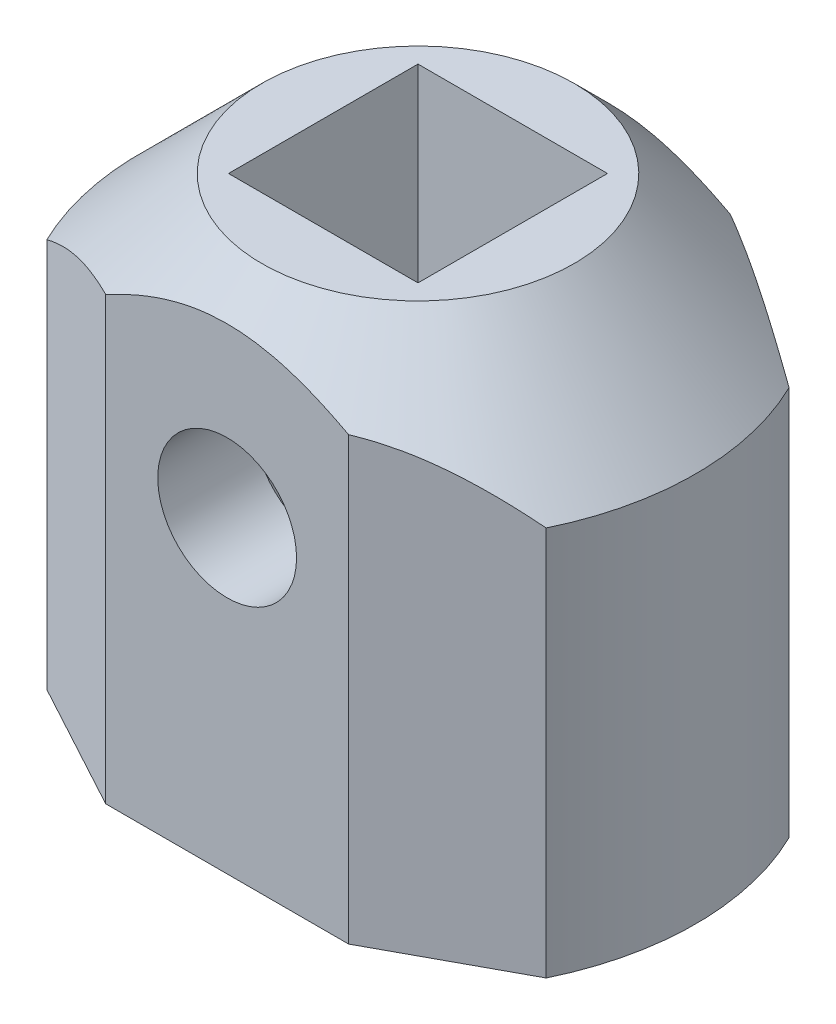
ISO-10303-21;
HEADER;
FILE_DESCRIPTION(('STEP AP214'),'2;1');
FILE_NAME('part.step','',(''),(''),'','','');
FILE_SCHEMA(('AUTOMOTIVE_DESIGN { 1 0 10303 214 1 1 1 1 }'));
ENDSEC;
DATA;
#1=APPLICATION_CONTEXT('core data for automotive mechanical design processes');
#2=APPLICATION_PROTOCOL_DEFINITION('international standard','automotive_design',2000,#1);
#3=PRODUCT_CONTEXT('',#1,'mechanical');
#4=PRODUCT('Part','Part','',(#3));
#5=PRODUCT_RELATED_PRODUCT_CATEGORY('part','',(#4));
#6=PRODUCT_DEFINITION_FORMATION('','',#4);
#7=PRODUCT_DEFINITION_CONTEXT('part definition',#1,'design');
#8=PRODUCT_DEFINITION('design','',#6,#7);
#9=PRODUCT_DEFINITION_SHAPE('','',#8);
#10=(LENGTH_UNIT() NAMED_UNIT(*) SI_UNIT(.MILLI.,.METRE.));
#11=(NAMED_UNIT(*) PLANE_ANGLE_UNIT() SI_UNIT($,.RADIAN.));
#12=(NAMED_UNIT(*) SI_UNIT($,.STERADIAN.) SOLID_ANGLE_UNIT());
#13=UNCERTAINTY_MEASURE_WITH_UNIT(LENGTH_MEASURE(1.E-05),#10,'distance_accuracy_value','');
#14=(GEOMETRIC_REPRESENTATION_CONTEXT(3) GLOBAL_UNCERTAINTY_ASSIGNED_CONTEXT((#13)) GLOBAL_UNIT_ASSIGNED_CONTEXT((#10,
#11,#12)) REPRESENTATION_CONTEXT('',''));
#15=CARTESIAN_POINT('',(0.,0.,0.));
#16=DIRECTION('',(0.,0.,1.));
#17=DIRECTION('',(1.,0.,0.));
#18=AXIS2_PLACEMENT_3D('',#15,#16,#17);
#19=CARTESIAN_POINT('',(0.,22.464,0.));
#20=DIRECTION('',(0.,-1.,0.));
#21=DIRECTION('',(0.,0.,-1.));
#22=AXIS2_PLACEMENT_3D('',#19,#20,#21);
#23=CONICAL_SURFACE('',#22,16.,0.785398163397447);
#24=CARTESIAN_POINT('',(0.,29.464,0.));
#25=DIRECTION('',(0.,-1.,0.));
#26=DIRECTION('',(0.,0.,-1.));
#27=AXIS2_PLACEMENT_3D('',#24,#25,#26);
#28=CIRCLE('',#27,9.00000000000002);
#29=CARTESIAN_POINT('',(0.,29.464,-9.00000000000002));
#30=VERTEX_POINT('',#29);
#31=EDGE_CURVE('E11',#30,#30,#28,.T.);
#32=ORIENTED_EDGE('',*,*,#31,.T.);
#33=EDGE_LOOP('',(#32));
#34=FACE_BOUND('',#33,.T.);
#35=CARTESIAN_POINT('',(0.,22.464,0.));
#36=DIRECTION('',(0.,-1.,0.));
#37=DIRECTION('',(0.,0.,-1.));
#38=AXIS2_PLACEMENT_3D('',#35,#36,#37);
#39=CIRCLE('',#38,16.);
#40=CARTESIAN_POINT('',(14.3874945699382,22.464,-7.));
#41=VERTEX_POINT('',#40);
#42=CARTESIAN_POINT('',(14.3874945699382,22.464,7.));
#43=VERTEX_POINT('',#42);
#44=EDGE_CURVE('E54',#41,#43,#39,.T.);
#45=ORIENTED_EDGE('',*,*,#44,.F.);
#46=CARTESIAN_POINT('',(14.3881945699382,22.4635363547934,-6.99962098110889));
#47=CARTESIAN_POINT('',(14.1851028529105,22.5980406777574,-7.10958612022604));
#48=CARTESIAN_POINT('',(13.9807474583945,22.7301120897886,-7.22023548454374));
#49=CARTESIAN_POINT('',(13.5692631532771,22.9886807150532,-7.44303594888079));
#50=CARTESIAN_POINT('',(13.3621335541935,23.1151765098494,-7.55518742168269));
#51=CARTESIAN_POINT('',(12.9442139329043,23.3622561726794,-7.78147232373314));
#52=CARTESIAN_POINT('',(12.7334134971381,23.4828173676111,-7.89561139146197));
#53=CARTESIAN_POINT('',(12.3087270731656,23.7166316413264,-8.12556021644019));
#54=CARTESIAN_POINT('',(12.0948413165055,23.8298852650712,-8.24136984831751));
#55=CARTESIAN_POINT('',(11.4591661570757,24.1517298344361,-8.585559696939));
#56=CARTESIAN_POINT('',(11.0327604095866,24.3487642471816,-8.81643945919255));
#57=CARTESIAN_POINT('',(10.1676258943876,24.7024742765252,-9.2848713514985));
#58=CARTESIAN_POINT('',(9.72891628247859,24.8592091449242,-9.52241310953603));
#59=CARTESIAN_POINT('',(9.03405836259148,25.0654273254393,-9.89864779278829));
#60=CARTESIAN_POINT('',(8.78177393245917,25.1318682695485,-10.0352485998651));
#61=CARTESIAN_POINT('',(8.27412811177097,25.247352748142,-10.3101162513441));
#62=CARTESIAN_POINT('',(8.01876689904798,25.2963972831695,-10.4483829994577));
#63=CARTESIAN_POINT('',(7.50221660435466,25.3762573162241,-10.7280720278844));
#64=CARTESIAN_POINT('',(7.24099574244711,25.4068116946165,-10.8695115156211));
#65=CARTESIAN_POINT('',(6.84820139270233,25.4374609635023,-11.0821921997292));
#66=CARTESIAN_POINT('',(6.71705870334872,25.4451470354123,-11.1532001378668));
#67=CARTESIAN_POINT('',(6.45461177166653,25.4554017229482,-11.2953034878985));
#68=CARTESIAN_POINT('',(6.32330752094976,25.4579700605851,-11.3663989043343));
#69=CARTESIAN_POINT('',(6.19199274252094,25.4579559874979,-11.4375000210583));
#70=B_SPLINE_CURVE_WITH_KNOTS('',3,(#46,#47,#48,#49,#50,#51,#52,#53,#54,#55,#56,#57,#58,#59,#60,
#61,#62,#63,#64,#65,#66,#67,#68,#69),.UNSPECIFIED.,.F.,.F.,(4,2,2,2,2,2,2,2,2,2,2,4),(0.,
0.801801615490777,1.60380604573544,2.40866837643169,3.21347061507806,4.78226777879521,
6.34874500140837,7.23173984559704,8.11468389667328,9.00982244437585,9.45773711573801,
9.9056761166061),.UNSPECIFIED.);
#71=CARTESIAN_POINT('',(7.,25.4255951895947,-11.));
#72=VERTEX_POINT('',#71);
#73=EDGE_CURVE('E302',#41,#72,#70,.T.);
#74=ORIENTED_EDGE('',*,*,#73,.T.);
#75=CARTESIAN_POINT('',(22.6526758424985,13.2817895564087,-11.));
#76=CARTESIAN_POINT('',(22.3225908517635,13.5787127757458,-11.));
#77=CARTESIAN_POINT('',(21.991896621502,13.8749574028181,-11.));
#78=CARTESIAN_POINT('',(21.3291245263622,14.4658953945252,-11.));
#79=CARTESIAN_POINT('',(20.997046659691,14.7605887571488,-11.));
#80=CARTESIAN_POINT('',(19.9982834731082,15.6422330081576,-11.));
#81=CARTESIAN_POINT('',(19.3292743182953,16.2265625505251,-11.));
#82=CARTESIAN_POINT('',(18.3161941630919,17.0992318250546,-11.));
#83=CARTESIAN_POINT('',(17.975083734541,17.3910108137231,-11.));
#84=CARTESIAN_POINT('',(17.2905359025944,17.9718123143659,-11.));
#85=CARTESIAN_POINT('',(16.947098556218,18.2608348934689,-11.));
#86=CARTESIAN_POINT('',(16.2576117452525,18.8356099498346,-11.));
#87=CARTESIAN_POINT('',(15.911562813525,19.1213630657701,-11.));
#88=CARTESIAN_POINT('',(15.2163358462304,19.6891071747689,-11.));
#89=CARTESIAN_POINT('',(14.8671575292726,19.971097823725,-11.));
#90=CARTESIAN_POINT('',(14.1963474269109,20.5057435519179,-11.));
#91=CARTESIAN_POINT('',(13.8750208909719,20.7587812389504,-11.));
#92=CARTESIAN_POINT('',(13.2289272730813,21.2604232206822,-11.));
#93=CARTESIAN_POINT('',(12.9041602380389,21.5090275757037,-11.));
#94=CARTESIAN_POINT('',(12.2506806278469,22.0009231246979,-11.));
#95=CARTESIAN_POINT('',(11.9219685299482,22.2442149515073,-11.));
#96=CARTESIAN_POINT('',(11.2599329420419,22.724427172336,-11.));
#97=CARTESIAN_POINT('',(10.926609645961,22.9613478330725,-11.));
#98=CARTESIAN_POINT('',(10.2553544975084,23.426914041819,-11.));
#99=CARTESIAN_POINT('',(9.9174350387773,23.6555774051557,-11.));
#100=CARTESIAN_POINT('',(9.23533896145236,24.1034536055365,-11.));
#101=CARTESIAN_POINT('',(8.89116198534246,24.322665900177,-11.));
#102=CARTESIAN_POINT('',(8.19584867652193,24.749169013083,-11.));
#103=CARTESIAN_POINT('',(7.8447182575215,24.9564694220773,-11.));
#104=CARTESIAN_POINT('',(7.13420419834428,25.356344726103,-11.));
#105=CARTESIAN_POINT('',(6.77482204995186,25.5489222559674,-11.));
#106=CARTESIAN_POINT('',(6.06999242185741,25.9038182116208,-11.));
#107=CARTESIAN_POINT('',(5.72512947903085,26.0672851746653,-11.));
#108=CARTESIAN_POINT('',(5.20119857101354,26.297328724293,-11.));
#109=CARTESIAN_POINT('',(5.02544839840215,26.3714839272554,-11.));
#110=CARTESIAN_POINT('',(4.6716178980095,26.5141972423,-11.));
#111=CARTESIAN_POINT('',(4.49353674022899,26.5827532941028,-11.));
#112=CARTESIAN_POINT('',(3.95685424242002,26.7787111981025,-11.));
#113=CARTESIAN_POINT('',(3.59479196532077,26.896858533995,-11.));
#114=CARTESIAN_POINT('',(2.86227632921661,27.1031295432642,-11.));
#115=CARTESIAN_POINT('',(2.49182713812875,27.1912677950593,-11.));
#116=CARTESIAN_POINT('',(1.8006328494662,27.3219569230523,-11.));
#117=CARTESIAN_POINT('',(1.48081499966506,27.3693775566775,-11.));
#118=CARTESIAN_POINT('',(0.838295004388696,27.4367267021363,-11.));
#119=CARTESIAN_POINT('',(0.515593297572812,27.4566593258326,-11.));
#120=CARTESIAN_POINT('',(-0.130041419252961,27.4679625220343,-11.));
#121=CARTESIAN_POINT('',(-0.452973991307219,27.45935765639,-11.));
#122=CARTESIAN_POINT('',(-1.09687490256551,27.4141182825037,-11.));
#123=CARTESIAN_POINT('',(-1.41784293265245,27.3774794719372,-11.));
#124=CARTESIAN_POINT('',(-2.1450960846299,27.264049444662,-11.));
#125=CARTESIAN_POINT('',(-2.55007413936234,27.1788814032015,-11.));
#126=CARTESIAN_POINT('',(-3.3505386091478,26.9715588013787,-11.));
#127=CARTESIAN_POINT('',(-3.74601855263938,26.8493797542278,-11.));
#128=CARTESIAN_POINT('',(-4.33212264502633,26.6431037178567,-11.));
#129=CARTESIAN_POINT('',(-4.52682762968465,26.5702793666911,-11.));
#130=CARTESIAN_POINT('',(-4.91345589059074,26.4178176901091,-11.));
#131=CARTESIAN_POINT('',(-5.1053804150576,26.3381835400721,-11.));
#132=CARTESIAN_POINT('',(-5.48655767269623,26.1728315425421,-11.));
#133=CARTESIAN_POINT('',(-5.6758106474801,26.0871142494833,-11.));
#134=CARTESIAN_POINT('',(-6.05178495432151,25.9102520121317,-11.));
#135=CARTESIAN_POINT('',(-6.23850595810373,25.8191063721485,-11.));
#136=CARTESIAN_POINT('',(-6.73348981609076,25.5694895356596,-11.));
#137=CARTESIAN_POINT('',(-7.03959297990541,25.4067291166981,-11.));
#138=CARTESIAN_POINT('',(-7.64572098308322,25.0702133204358,-11.));
#139=CARTESIAN_POINT('',(-7.94574472593359,24.8964559825768,-11.));
#140=CARTESIAN_POINT('',(-8.54053318317155,24.5397750804912,-11.));
#141=CARTESIAN_POINT('',(-8.83529445828309,24.3568457993828,-11.));
#142=CARTESIAN_POINT('',(-9.41998338933114,23.9834790714394,-11.));
#143=CARTESIAN_POINT('',(-9.70991131263404,23.7930420418844,-11.));
#144=CARTESIAN_POINT('',(-10.2862726963489,23.4053872470851,-11.));
#145=CARTESIAN_POINT('',(-10.5726952345203,23.2081532823078,-11.));
#146=CARTESIAN_POINT('',(-11.1418029728309,22.8083693606174,-11.));
#147=CARTESIAN_POINT('',(-11.4244881298321,22.605819342425,-11.));
#148=CARTESIAN_POINT('',(-11.9864742524702,22.1962851892091,-11.));
#149=CARTESIAN_POINT('',(-12.2657763470635,21.9893026009765,-11.));
#150=CARTESIAN_POINT('',(-12.8214876028255,21.5714857610534,-11.));
#151=CARTESIAN_POINT('',(-13.0978967096169,21.3606514371684,-11.));
#152=CARTESIAN_POINT('',(-13.9253129899641,20.721653113059,-11.));
#153=CARTESIAN_POINT('',(-14.4724654391185,20.288495161914,-11.));
#154=CARTESIAN_POINT('',(-15.5587315893129,19.4121923513498,-11.));
#155=CARTESIAN_POINT('',(-16.0978447696602,18.9690468496784,-11.));
#156=CARTESIAN_POINT('',(-17.168930223256,18.0756443833484,-11.));
#157=CARTESIAN_POINT('',(-17.7009109753228,17.6253975666217,-11.));
#158=CARTESIAN_POINT('',(-18.7596743040679,16.7188698714098,-11.));
#159=CARTESIAN_POINT('',(-19.2864570068464,16.2625891399339,-11.));
#160=CARTESIAN_POINT('',(-20.2888369443288,15.3862391818615,-11.));
#161=CARTESIAN_POINT('',(-20.764796177996,14.9665833569552,-11.));
#162=CARTESIAN_POINT('',(-21.7117908638606,14.1256513491316,-11.));
#163=CARTESIAN_POINT('',(-22.1828385109447,13.7043889052179,-11.));
#164=CARTESIAN_POINT('',(-22.6526758424985,13.2817895564087,-11.));
#165=B_SPLINE_CURVE_WITH_KNOTS('',3,(#75,#76,#77,#78,#79,#80,#81,#82,#83,#84,#85,#86,#87,#88,
#89,#90,#91,#92,#93,#94,#95,#96,#97,#98,#99,#100,#101,#102,#103,#104,#105,#106,#107,#108,#109,
#110,#111,#112,#113,#114,#115,#116,#117,#118,#119,#120,#121,#122,#123,#124,#125,#126,#127,#128,
#129,#130,#131,#132,#133,#134,#135,#136,#137,#138,#139,#140,#141,#142,#143,#144,#145,#146,#147,
#148,#149,#150,#151,#152,#153,#154,#155,#156,#157,#158,#159,#160,#161,#162,#163,#164),
.UNSPECIFIED.,.F.,.F.,(4,2,2,2,2,2,2,2,2,2,2,2,2,2,2,2,2,2,2,2,2,2,2,2,2,2,2,2,2,2,2,2,2,2,2,2,
2,2,2,2,2,2,2,2,4),(0.,1.3319409112377,2.6638835490157,5.32859989315058,6.67522227427417,
8.02181177602605,9.36813357611891,10.7145776753775,11.9415374024613,13.1684804221611,
14.3952764802739,15.6220211006315,16.8459380819643,18.0699252115159,19.2929126395021,
20.5156806846204,21.6600268471693,22.2322028317534,22.8045884160428,23.9460094783111,
25.086875244197,26.0557283774788,27.0244365667159,27.9923112177182,28.9603344366934,
30.1997314202627,31.4399501967675,32.0634813666332,32.6867233557322,33.3099086136415,
33.9331739108204,34.9729277818658,36.0128675478687,37.0534637688224,38.0940022348525,
39.1372204202624,40.1804506363455,41.223322554747,42.2662140401714,44.3596025349951,
46.45312603199,48.5438889438937,50.6346010103237,52.538221545099,54.4340217805539),.UNSPECIFIED.);
#166=CARTESIAN_POINT('',(-7.,25.4255951895947,-11.));
#167=VERTEX_POINT('',#166);
#168=EDGE_CURVE('E257',#72,#167,#165,.T.);
#169=ORIENTED_EDGE('',*,*,#168,.T.);
#170=CARTESIAN_POINT('',(-14.3881945699382,22.4635363547934,-6.99962098110889));
#171=CARTESIAN_POINT('',(-14.1851028529105,22.5980406777574,-7.10958612022604));
#172=CARTESIAN_POINT('',(-13.9807474583945,22.7301120897886,-7.22023548454374));
#173=CARTESIAN_POINT('',(-13.5692631532771,22.9886807150532,-7.44303594888079));
#174=CARTESIAN_POINT('',(-13.3621335541935,23.1151765098494,-7.55518742168269));
#175=CARTESIAN_POINT('',(-12.9442139329043,23.3622561726794,-7.78147232373314));
#176=CARTESIAN_POINT('',(-12.7334134971381,23.4828173676111,-7.89561139146197));
#177=CARTESIAN_POINT('',(-12.3087270731656,23.7166316413264,-8.12556021644019));
#178=CARTESIAN_POINT('',(-12.0948413165055,23.8298852650712,-8.24136984831751));
#179=CARTESIAN_POINT('',(-11.4591661570757,24.1517298344361,-8.585559696939));
#180=CARTESIAN_POINT('',(-11.0327604095866,24.3487642471816,-8.81643945919255));
#181=CARTESIAN_POINT('',(-10.1676258943876,24.7024742765252,-9.2848713514985));
#182=CARTESIAN_POINT('',(-9.72891628247859,24.8592091449242,-9.52241310953603));
#183=CARTESIAN_POINT('',(-9.03405836259148,25.0654273254393,-9.89864779278829));
#184=CARTESIAN_POINT('',(-8.78177393245917,25.1318682695485,-10.0352485998651));
#185=CARTESIAN_POINT('',(-8.27412811177097,25.247352748142,-10.3101162513441));
#186=CARTESIAN_POINT('',(-8.01876689904798,25.2963972831695,-10.4483829994577));
#187=CARTESIAN_POINT('',(-7.50221660435466,25.3762573162241,-10.7280720278844));
#188=CARTESIAN_POINT('',(-7.24099574244711,25.4068116946165,-10.8695115156211));
#189=CARTESIAN_POINT('',(-6.84820139270233,25.4374609635023,-11.0821921997292));
#190=CARTESIAN_POINT('',(-6.71705870334872,25.4451470354123,-11.1532001378668));
#191=CARTESIAN_POINT('',(-6.45461177166653,25.4554017229482,-11.2953034878985));
#192=CARTESIAN_POINT('',(-6.32330752094976,25.4579700605851,-11.3663989043343));
#193=CARTESIAN_POINT('',(-6.19199274252094,25.4579559874979,-11.4375000210583));
#194=B_SPLINE_CURVE_WITH_KNOTS('',3,(#170,#171,#172,#173,#174,#175,#176,#177,#178,#179,#180,
#181,#182,#183,#184,#185,#186,#187,#188,#189,#190,#191,#192,#193),.UNSPECIFIED.,.F.,.F.,(4,2,2,
2,2,2,2,2,2,2,2,4),(0.,0.801801615490777,1.60380604573544,2.40866837643169,3.21347061507806,
4.78226777879521,6.34874500140837,7.23173984559704,8.11468389667328,9.00982244437585,
9.45773711573801,9.9056761166061),.UNSPECIFIED.);
#195=CARTESIAN_POINT('',(-14.3874945699382,22.464,-7.));
#196=VERTEX_POINT('',#195);
#197=EDGE_CURVE('E265',#196,#167,#194,.T.);
#198=ORIENTED_EDGE('',*,*,#197,.F.);
#199=CARTESIAN_POINT('',(-14.3874945699382,22.464,7.));
#200=VERTEX_POINT('',#199);
#201=EDGE_CURVE('E305',#200,#196,#39,.T.);
#202=ORIENTED_EDGE('',*,*,#201,.F.);
#203=CARTESIAN_POINT('',(-14.3881945699382,22.4635363547934,6.99962098110889));
#204=CARTESIAN_POINT('',(-14.1851028529105,22.5980406777574,7.10958612022604));
#205=CARTESIAN_POINT('',(-13.9807474583945,22.7301120897886,7.22023548454374));
#206=CARTESIAN_POINT('',(-13.5692631532771,22.9886807150532,7.44303594888079));
#207=CARTESIAN_POINT('',(-13.3621335541935,23.1151765098494,7.55518742168269));
#208=CARTESIAN_POINT('',(-12.9442139329043,23.3622561726794,7.78147232373314));
#209=CARTESIAN_POINT('',(-12.7334134971381,23.4828173676111,7.89561139146197));
#210=CARTESIAN_POINT('',(-12.3087270731656,23.7166316413264,8.12556021644019));
#211=CARTESIAN_POINT('',(-12.0948413165055,23.8298852650712,8.24136984831751));
#212=CARTESIAN_POINT('',(-11.4591661570757,24.1517298344361,8.585559696939));
#213=CARTESIAN_POINT('',(-11.0327604095866,24.3487642471816,8.81643945919255));
#214=CARTESIAN_POINT('',(-10.1676258943876,24.7024742765252,9.2848713514985));
#215=CARTESIAN_POINT('',(-9.72891628247859,24.8592091449242,9.52241310953603));
#216=CARTESIAN_POINT('',(-9.03405836259148,25.0654273254393,9.89864779278829));
#217=CARTESIAN_POINT('',(-8.78177393245917,25.1318682695485,10.0352485998651));
#218=CARTESIAN_POINT('',(-8.27412811177097,25.247352748142,10.3101162513441));
#219=CARTESIAN_POINT('',(-8.01876689904798,25.2963972831695,10.4483829994577));
#220=CARTESIAN_POINT('',(-7.50221660435466,25.3762573162241,10.7280720278844));
#221=CARTESIAN_POINT('',(-7.24099574244711,25.4068116946165,10.8695115156211));
#222=CARTESIAN_POINT('',(-6.84820139270233,25.4374609635023,11.0821921997292));
#223=CARTESIAN_POINT('',(-6.71705870334872,25.4451470354123,11.1532001378668));
#224=CARTESIAN_POINT('',(-6.45461177166653,25.4554017229482,11.2953034878985));
#225=CARTESIAN_POINT('',(-6.32330752094976,25.4579700605851,11.3663989043343));
#226=CARTESIAN_POINT('',(-6.19199274252094,25.4579559874979,11.4375000210583));
#227=B_SPLINE_CURVE_WITH_KNOTS('',3,(#203,#204,#205,#206,#207,#208,#209,#210,#211,#212,#213,
#214,#215,#216,#217,#218,#219,#220,#221,#222,#223,#224,#225,#226),.UNSPECIFIED.,.F.,.F.,(4,2,2,
2,2,2,2,2,2,2,2,4),(0.,0.801801615490777,1.60380604573544,2.40866837643169,3.21347061507806,
4.78226777879521,6.34874500140837,7.23173984559704,8.11468389667328,9.00982244437585,
9.45773711573801,9.9056761166061),.UNSPECIFIED.);
#228=CARTESIAN_POINT('',(-7.,25.4255951895947,11.));
#229=VERTEX_POINT('',#228);
#230=EDGE_CURVE('E199',#200,#229,#227,.T.);
#231=ORIENTED_EDGE('',*,*,#230,.T.);
#232=CARTESIAN_POINT('',(22.6526758424985,13.2817895564087,11.));
#233=CARTESIAN_POINT('',(22.3225908517635,13.5787127757458,11.));
#234=CARTESIAN_POINT('',(21.991896621502,13.8749574028181,11.));
#235=CARTESIAN_POINT('',(21.3291245263622,14.4658953945252,11.));
#236=CARTESIAN_POINT('',(20.997046659691,14.7605887571488,11.));
#237=CARTESIAN_POINT('',(19.9982834731082,15.6422330081576,11.));
#238=CARTESIAN_POINT('',(19.3292743182953,16.2265625505251,11.));
#239=CARTESIAN_POINT('',(18.3161941630919,17.0992318250546,11.));
#240=CARTESIAN_POINT('',(17.975083734541,17.3910108137231,11.));
#241=CARTESIAN_POINT('',(17.2905359025944,17.9718123143659,11.));
#242=CARTESIAN_POINT('',(16.947098556218,18.2608348934689,11.));
#243=CARTESIAN_POINT('',(16.2576117452525,18.8356099498346,11.));
#244=CARTESIAN_POINT('',(15.911562813525,19.1213630657701,11.));
#245=CARTESIAN_POINT('',(15.2163358462304,19.6891071747689,11.));
#246=CARTESIAN_POINT('',(14.8671575292726,19.971097823725,11.));
#247=CARTESIAN_POINT('',(14.1963474269109,20.5057435519179,11.));
#248=CARTESIAN_POINT('',(13.8750208909719,20.7587812389504,11.));
#249=CARTESIAN_POINT('',(13.2289272730813,21.2604232206822,11.));
#250=CARTESIAN_POINT('',(12.9041602380389,21.5090275757037,11.));
#251=CARTESIAN_POINT('',(12.2506806278469,22.0009231246979,11.));
#252=CARTESIAN_POINT('',(11.9219685299482,22.2442149515073,11.));
#253=CARTESIAN_POINT('',(11.2599329420419,22.724427172336,11.));
#254=CARTESIAN_POINT('',(10.926609645961,22.9613478330725,11.));
#255=CARTESIAN_POINT('',(10.2553544975084,23.426914041819,11.));
#256=CARTESIAN_POINT('',(9.9174350387773,23.6555774051557,11.));
#257=CARTESIAN_POINT('',(9.23533896145236,24.1034536055365,11.));
#258=CARTESIAN_POINT('',(8.89116198534246,24.322665900177,11.));
#259=CARTESIAN_POINT('',(8.19584867652193,24.749169013083,11.));
#260=CARTESIAN_POINT('',(7.8447182575215,24.9564694220773,11.));
#261=CARTESIAN_POINT('',(7.13420419834428,25.356344726103,11.));
#262=CARTESIAN_POINT('',(6.77482204995186,25.5489222559674,11.));
#263=CARTESIAN_POINT('',(6.06999242185741,25.9038182116208,11.));
#264=CARTESIAN_POINT('',(5.72512947903085,26.0672851746653,11.));
#265=CARTESIAN_POINT('',(5.20119857101354,26.297328724293,11.));
#266=CARTESIAN_POINT('',(5.02544839840215,26.3714839272554,11.));
#267=CARTESIAN_POINT('',(4.6716178980095,26.5141972423,11.));
#268=CARTESIAN_POINT('',(4.49353674022899,26.5827532941028,11.));
#269=CARTESIAN_POINT('',(3.95685424242002,26.7787111981025,11.));
#270=CARTESIAN_POINT('',(3.59479196532077,26.896858533995,11.));
#271=CARTESIAN_POINT('',(2.86227632921661,27.1031295432642,11.));
#272=CARTESIAN_POINT('',(2.49182713812875,27.1912677950593,11.));
#273=CARTESIAN_POINT('',(1.8006328494662,27.3219569230523,11.));
#274=CARTESIAN_POINT('',(1.48081499966506,27.3693775566775,11.));
#275=CARTESIAN_POINT('',(0.838295004388696,27.4367267021363,11.));
#276=CARTESIAN_POINT('',(0.515593297572812,27.4566593258326,11.));
#277=CARTESIAN_POINT('',(-0.130041419252961,27.4679625220343,11.));
#278=CARTESIAN_POINT('',(-0.452973991307219,27.45935765639,11.));
#279=CARTESIAN_POINT('',(-1.09687490256551,27.4141182825037,11.));
#280=CARTESIAN_POINT('',(-1.41784293265245,27.3774794719372,11.));
#281=CARTESIAN_POINT('',(-2.1450960846299,27.264049444662,11.));
#282=CARTESIAN_POINT('',(-2.55007413936234,27.1788814032015,11.));
#283=CARTESIAN_POINT('',(-3.3505386091478,26.9715588013787,11.));
#284=CARTESIAN_POINT('',(-3.74601855263938,26.8493797542278,11.));
#285=CARTESIAN_POINT('',(-4.33212264502633,26.6431037178567,11.));
#286=CARTESIAN_POINT('',(-4.52682762968465,26.5702793666911,11.));
#287=CARTESIAN_POINT('',(-4.91345589059074,26.4178176901091,11.));
#288=CARTESIAN_POINT('',(-5.1053804150576,26.3381835400721,11.));
#289=CARTESIAN_POINT('',(-5.48655767269623,26.1728315425421,11.));
#290=CARTESIAN_POINT('',(-5.6758106474801,26.0871142494833,11.));
#291=CARTESIAN_POINT('',(-6.05178495432151,25.9102520121317,11.));
#292=CARTESIAN_POINT('',(-6.23850595810373,25.8191063721485,11.));
#293=CARTESIAN_POINT('',(-6.73348981609076,25.5694895356596,11.));
#294=CARTESIAN_POINT('',(-7.03959297990541,25.4067291166981,11.));
#295=CARTESIAN_POINT('',(-7.64572098308322,25.0702133204358,11.));
#296=CARTESIAN_POINT('',(-7.94574472593359,24.8964559825768,11.));
#297=CARTESIAN_POINT('',(-8.54053318317155,24.5397750804912,11.));
#298=CARTESIAN_POINT('',(-8.83529445828309,24.3568457993828,11.));
#299=CARTESIAN_POINT('',(-9.41998338933114,23.9834790714394,11.));
#300=CARTESIAN_POINT('',(-9.70991131263404,23.7930420418844,11.));
#301=CARTESIAN_POINT('',(-10.2862726963489,23.4053872470851,11.));
#302=CARTESIAN_POINT('',(-10.5726952345203,23.2081532823078,11.));
#303=CARTESIAN_POINT('',(-11.1418029728309,22.8083693606174,11.));
#304=CARTESIAN_POINT('',(-11.4244881298321,22.605819342425,11.));
#305=CARTESIAN_POINT('',(-11.9864742524702,22.1962851892091,11.));
#306=CARTESIAN_POINT('',(-12.2657763470635,21.9893026009765,11.));
#307=CARTESIAN_POINT('',(-12.8214876028255,21.5714857610534,11.));
#308=CARTESIAN_POINT('',(-13.0978967096169,21.3606514371684,11.));
#309=CARTESIAN_POINT('',(-13.9253129899641,20.721653113059,11.));
#310=CARTESIAN_POINT('',(-14.4724654391185,20.288495161914,11.));
#311=CARTESIAN_POINT('',(-15.5587315893129,19.4121923513498,11.));
#312=CARTESIAN_POINT('',(-16.0978447696602,18.9690468496784,11.));
#313=CARTESIAN_POINT('',(-17.168930223256,18.0756443833484,11.));
#314=CARTESIAN_POINT('',(-17.7009109753228,17.6253975666217,11.));
#315=CARTESIAN_POINT('',(-18.7596743040679,16.7188698714098,11.));
#316=CARTESIAN_POINT('',(-19.2864570068464,16.2625891399339,11.));
#317=CARTESIAN_POINT('',(-20.2888369443288,15.3862391818615,11.));
#318=CARTESIAN_POINT('',(-20.764796177996,14.9665833569552,11.));
#319=CARTESIAN_POINT('',(-21.7117908638606,14.1256513491316,11.));
#320=CARTESIAN_POINT('',(-22.1828385109447,13.7043889052179,11.));
#321=CARTESIAN_POINT('',(-22.6526758424985,13.2817895564087,11.));
#322=B_SPLINE_CURVE_WITH_KNOTS('',3,(#232,#233,#234,#235,#236,#237,#238,#239,#240,#241,#242,
#243,#244,#245,#246,#247,#248,#249,#250,#251,#252,#253,#254,#255,#256,#257,#258,#259,#260,#261,
#262,#263,#264,#265,#266,#267,#268,#269,#270,#271,#272,#273,#274,#275,#276,#277,#278,#279,#280,
#281,#282,#283,#284,#285,#286,#287,#288,#289,#290,#291,#292,#293,#294,#295,#296,#297,#298,#299,
#300,#301,#302,#303,#304,#305,#306,#307,#308,#309,#310,#311,#312,#313,#314,#315,#316,#317,#318,
#319,#320,#321),.UNSPECIFIED.,.F.,.F.,(4,2,2,2,2,2,2,2,2,2,2,2,2,2,2,2,2,2,2,2,2,2,2,2,2,2,2,2,
2,2,2,2,2,2,2,2,2,2,2,2,2,2,2,2,4),(0.,1.3319409112377,2.6638835490157,5.32859989315058,
6.67522227427417,8.02181177602605,9.36813357611891,10.7145776753775,11.9415374024613,
13.1684804221611,14.3952764802739,15.6220211006315,16.8459380819643,18.0699252115159,
19.2929126395021,20.5156806846204,21.6600268471693,22.2322028317534,22.8045884160428,
23.9460094783111,25.086875244197,26.0557283774788,27.0244365667159,27.9923112177182,
28.9603344366934,30.1997314202627,31.4399501967675,32.0634813666332,32.6867233557322,
33.3099086136415,33.9331739108204,34.9729277818658,36.0128675478687,37.0534637688224,
38.0940022348525,39.1372204202624,40.1804506363455,41.223322554747,42.2662140401714,
44.3596025349951,46.45312603199,48.5438889438937,50.6346010103237,52.538221545099,
54.4340217805539),.UNSPECIFIED.);
#323=CARTESIAN_POINT('',(7.,25.4255951895947,11.));
#324=VERTEX_POINT('',#323);
#325=EDGE_CURVE('E222',#324,#229,#322,.T.);
#326=ORIENTED_EDGE('',*,*,#325,.F.);
#327=CARTESIAN_POINT('',(14.3881945699382,22.4635363547934,6.99962098110889));
#328=CARTESIAN_POINT('',(14.1851028529105,22.5980406777574,7.10958612022604));
#329=CARTESIAN_POINT('',(13.9807474583945,22.7301120897886,7.22023548454374));
#330=CARTESIAN_POINT('',(13.5692631532771,22.9886807150532,7.44303594888079));
#331=CARTESIAN_POINT('',(13.3621335541935,23.1151765098494,7.55518742168269));
#332=CARTESIAN_POINT('',(12.9442139329043,23.3622561726794,7.78147232373314));
#333=CARTESIAN_POINT('',(12.7334134971381,23.4828173676111,7.89561139146197));
#334=CARTESIAN_POINT('',(12.3087270731656,23.7166316413264,8.12556021644019));
#335=CARTESIAN_POINT('',(12.0948413165055,23.8298852650712,8.24136984831751));
#336=CARTESIAN_POINT('',(11.4591661570757,24.1517298344361,8.585559696939));
#337=CARTESIAN_POINT('',(11.0327604095866,24.3487642471816,8.81643945919255));
#338=CARTESIAN_POINT('',(10.1676258943876,24.7024742765252,9.2848713514985));
#339=CARTESIAN_POINT('',(9.72891628247859,24.8592091449242,9.52241310953603));
#340=CARTESIAN_POINT('',(9.03405836259148,25.0654273254393,9.89864779278829));
#341=CARTESIAN_POINT('',(8.78177393245917,25.1318682695485,10.0352485998651));
#342=CARTESIAN_POINT('',(8.27412811177097,25.247352748142,10.3101162513441));
#343=CARTESIAN_POINT('',(8.01876689904798,25.2963972831695,10.4483829994577));
#344=CARTESIAN_POINT('',(7.50221660435466,25.3762573162241,10.7280720278844));
#345=CARTESIAN_POINT('',(7.24099574244711,25.4068116946165,10.8695115156211));
#346=CARTESIAN_POINT('',(6.84820139270233,25.4374609635023,11.0821921997292));
#347=CARTESIAN_POINT('',(6.71705870334872,25.4451470354123,11.1532001378668));
#348=CARTESIAN_POINT('',(6.45461177166653,25.4554017229482,11.2953034878985));
#349=CARTESIAN_POINT('',(6.32330752094976,25.4579700605851,11.3663989043343));
#350=CARTESIAN_POINT('',(6.19199274252094,25.4579559874979,11.4375000210583));
#351=B_SPLINE_CURVE_WITH_KNOTS('',3,(#327,#328,#329,#330,#331,#332,#333,#334,#335,#336,#337,
#338,#339,#340,#341,#342,#343,#344,#345,#346,#347,#348,#349,#350),.UNSPECIFIED.,.F.,.F.,(4,2,2,
2,2,2,2,2,2,2,2,4),(0.,0.801801615490777,1.60380604573544,2.40866837643169,3.21347061507806,
4.78226777879521,6.34874500140837,7.23173984559704,8.11468389667328,9.00982244437585,
9.45773711573801,9.9056761166061),.UNSPECIFIED.);
#352=EDGE_CURVE('E251',#43,#324,#351,.T.);
#353=ORIENTED_EDGE('',*,*,#352,.F.);
#354=EDGE_LOOP('',(#45,#74,#169,#198,#202,#231,#326,#353));
#355=FACE_BOUND('',#354,.T.);
#356=ADVANCED_FACE('F45',(#34,#355),#23,.T.);
#357=CARTESIAN_POINT('',(0.,0.,0.));
#358=DIRECTION('',(0.,-1.,0.));
#359=DIRECTION('',(0.,0.,-1.));
#360=AXIS2_PLACEMENT_3D('',#357,#358,#359);
#361=CYLINDRICAL_SURFACE('',#360,16.);
#362=CARTESIAN_POINT('',(0.,0.,0.));
#363=DIRECTION('',(0.,-1.,0.));
#364=DIRECTION('',(0.,0.,-1.));
#365=AXIS2_PLACEMENT_3D('',#362,#363,#364);
#366=CIRCLE('',#365,16.);
#367=CARTESIAN_POINT('',(14.3874945699382,0.,-7.));
#368=VERTEX_POINT('',#367);
#369=CARTESIAN_POINT('',(14.3874945699382,0.,7.));
#370=VERTEX_POINT('',#369);
#371=EDGE_CURVE('E311',#368,#370,#366,.T.);
#372=ORIENTED_EDGE('',*,*,#371,.F.);
#373=DIRECTION('',(0.,-1.,0.));
#374=VECTOR('',#373,1.);
#375=CARTESIAN_POINT('',(14.3874945699382,29.464,-7.));
#376=LINE('',#375,#374);
#377=EDGE_CURVE('E197',#41,#368,#376,.T.);
#378=ORIENTED_EDGE('',*,*,#377,.F.);
#379=ORIENTED_EDGE('',*,*,#44,.T.);
#380=DIRECTION('',(0.,-1.,0.));
#381=VECTOR('',#380,1.);
#382=CARTESIAN_POINT('',(14.3874945699382,29.464,7.));
#383=LINE('',#382,#381);
#384=EDGE_CURVE('E184',#43,#370,#383,.T.);
#385=ORIENTED_EDGE('',*,*,#384,.T.);
#386=EDGE_LOOP('',(#372,#378,#379,#385));
#387=FACE_BOUND('',#386,.T.);
#388=ADVANCED_FACE('F289',(#387),#361,.T.);
#389=CARTESIAN_POINT('',(16.,0.,0.));
#390=DIRECTION('',(0.,-1.,0.));
#391=DIRECTION('',(0.,0.,-1.));
#392=AXIS2_PLACEMENT_3D('',#389,#390,#391);
#393=PLANE('',#392);
#394=DIRECTION('',(0.,0.,1.));
#395=VECTOR('',#394,1.);
#396=CARTESIAN_POINT('',(5.461,0.,5.461));
#397=LINE('',#396,#395);
#398=CARTESIAN_POINT('',(5.461,0.,-5.461));
#399=VERTEX_POINT('',#398);
#400=CARTESIAN_POINT('',(5.461,0.,5.461));
#401=VERTEX_POINT('',#400);
#402=EDGE_CURVE('E62',#399,#401,#397,.T.);
#403=ORIENTED_EDGE('',*,*,#402,.F.);
#404=DIRECTION('',(1.,0.,0.));
#405=VECTOR('',#404,1.);
#406=CARTESIAN_POINT('',(-5.461,0.,-5.461));
#407=LINE('',#406,#405);
#408=CARTESIAN_POINT('',(-5.461,0.,-5.461));
#409=VERTEX_POINT('',#408);
#410=EDGE_CURVE('E154',#409,#399,#407,.T.);
#411=ORIENTED_EDGE('',*,*,#410,.F.);
#412=DIRECTION('',(0.,0.,-1.));
#413=VECTOR('',#412,1.);
#414=CARTESIAN_POINT('',(-5.461,0.,5.461));
#415=LINE('',#414,#413);
#416=CARTESIAN_POINT('',(-5.461,0.,5.461));
#417=VERTEX_POINT('',#416);
#418=EDGE_CURVE('E157',#417,#409,#415,.T.);
#419=ORIENTED_EDGE('',*,*,#418,.F.);
#420=DIRECTION('',(-1.,0.,0.));
#421=VECTOR('',#420,1.);
#422=CARTESIAN_POINT('',(-5.461,0.,5.461));
#423=LINE('',#422,#421);
#424=EDGE_CURVE('E163',#401,#417,#423,.T.);
#425=ORIENTED_EDGE('',*,*,#424,.F.);
#426=EDGE_LOOP('',(#403,#411,#419,#425));
#427=FACE_BOUND('',#426,.T.);
#428=DIRECTION('',(1.,0.,0.));
#429=VECTOR('',#428,1.);
#430=CARTESIAN_POINT('',(0.,0.,-11.));
#431=LINE('',#430,#429);
#432=CARTESIAN_POINT('',(-7.,0.,-11.));
#433=VERTEX_POINT('',#432);
#434=CARTESIAN_POINT('',(7.,0.,-11.));
#435=VERTEX_POINT('',#434);
#436=EDGE_CURVE('E186',#433,#435,#431,.T.);
#437=ORIENTED_EDGE('',*,*,#436,.T.);
#438=DIRECTION('',(0.879369700163612,0.,0.476139612334617));
#439=VECTOR('',#438,1.);
#440=CARTESIAN_POINT('',(6.19269274252094,0.,-11.4371210021672));
#441=LINE('',#440,#439);
#442=EDGE_CURVE('E180',#435,#368,#441,.T.);
#443=ORIENTED_EDGE('',*,*,#442,.T.);
#444=ORIENTED_EDGE('',*,*,#371,.T.);
#445=DIRECTION('',(0.879369700163612,0.,-0.476139612334617));
#446=VECTOR('',#445,1.);
#447=CARTESIAN_POINT('',(6.19269274252094,0.,11.4371210021672));
#448=LINE('',#447,#446);
#449=CARTESIAN_POINT('',(7.,0.,11.));
#450=VERTEX_POINT('',#449);
#451=EDGE_CURVE('E179',#450,#370,#448,.T.);
#452=ORIENTED_EDGE('',*,*,#451,.F.);
#453=DIRECTION('',(1.,0.,0.));
#454=VECTOR('',#453,1.);
#455=CARTESIAN_POINT('',(0.,0.,11.));
#456=LINE('',#455,#454);
#457=CARTESIAN_POINT('',(-7.,0.,11.));
#458=VERTEX_POINT('',#457);
#459=EDGE_CURVE('E201',#458,#450,#456,.T.);
#460=ORIENTED_EDGE('',*,*,#459,.F.);
#461=DIRECTION('',(-0.879369700163612,0.,-0.476139612334617));
#462=VECTOR('',#461,1.);
#463=CARTESIAN_POINT('',(-6.19269274252094,0.,11.4371210021672));
#464=LINE('',#463,#462);
#465=CARTESIAN_POINT('',(-14.3874945699382,0.,7.));
#466=VERTEX_POINT('',#465);
#467=EDGE_CURVE('E204',#458,#466,#464,.T.);
#468=ORIENTED_EDGE('',*,*,#467,.T.);
#469=CARTESIAN_POINT('',(-14.3874945699382,0.,-7.));
#470=VERTEX_POINT('',#469);
#471=EDGE_CURVE('E450',#466,#470,#366,.T.);
#472=ORIENTED_EDGE('',*,*,#471,.T.);
#473=DIRECTION('',(-0.879369700163612,0.,0.476139612334617));
#474=VECTOR('',#473,1.);
#475=CARTESIAN_POINT('',(-6.19269274252094,0.,-11.4371210021672));
#476=LINE('',#475,#474);
#477=EDGE_CURVE('E183',#433,#470,#476,.T.);
#478=ORIENTED_EDGE('',*,*,#477,.F.);
#479=EDGE_LOOP('',(#437,#443,#444,#452,#460,#468,#472,#478));
#480=FACE_BOUND('',#479,.T.);
#481=ADVANCED_FACE('F250',(#427,#480),#393,.T.);
#482=CARTESIAN_POINT('',(4.925,29.464,0.));
#483=DIRECTION('',(0.,1.,0.));
#484=DIRECTION('',(0.,0.,1.));
#485=AXIS2_PLACEMENT_3D('',#482,#483,#484);
#486=PLANE('',#485);
#487=DIRECTION('',(0.,0.,1.));
#488=VECTOR('',#487,1.);
#489=CARTESIAN_POINT('',(5.461,29.464,5.461));
#490=LINE('',#489,#488);
#491=CARTESIAN_POINT('',(5.461,29.464,-5.461));
#492=VERTEX_POINT('',#491);
#493=CARTESIAN_POINT('',(5.461,29.464,5.461));
#494=VERTEX_POINT('',#493);
#495=EDGE_CURVE('E138',#492,#494,#490,.T.);
#496=ORIENTED_EDGE('',*,*,#495,.T.);
#497=DIRECTION('',(-1.,0.,0.));
#498=VECTOR('',#497,1.);
#499=CARTESIAN_POINT('',(-5.461,29.464,5.461));
#500=LINE('',#499,#498);
#501=CARTESIAN_POINT('',(-5.461,29.464,5.461));
#502=VERTEX_POINT('',#501);
#503=EDGE_CURVE('E147',#494,#502,#500,.T.);
#504=ORIENTED_EDGE('',*,*,#503,.T.);
#505=DIRECTION('',(0.,0.,-1.));
#506=VECTOR('',#505,1.);
#507=CARTESIAN_POINT('',(-5.461,29.464,5.461));
#508=LINE('',#507,#506);
#509=CARTESIAN_POINT('',(-5.461,29.464,-5.461));
#510=VERTEX_POINT('',#509);
#511=EDGE_CURVE('E70',#502,#510,#508,.T.);
#512=ORIENTED_EDGE('',*,*,#511,.T.);
#513=DIRECTION('',(1.,0.,0.));
#514=VECTOR('',#513,1.);
#515=CARTESIAN_POINT('',(-5.461,29.464,-5.461));
#516=LINE('',#515,#514);
#517=EDGE_CURVE('E144',#510,#492,#516,.T.);
#518=ORIENTED_EDGE('',*,*,#517,.T.);
#519=EDGE_LOOP('',(#496,#504,#512,#518));
#520=FACE_BOUND('',#519,.T.);
#521=ORIENTED_EDGE('',*,*,#31,.F.);
#522=EDGE_LOOP('',(#521));
#523=FACE_BOUND('',#522,.T.);
#524=ADVANCED_FACE('F47',(#520,#523),#486,.T.);
#525=DIRECTION('',(0.,-1.,0.));
#526=VECTOR('',#525,1.);
#527=CARTESIAN_POINT('',(-14.3874945699382,29.464,-7.));
#528=LINE('',#527,#526);
#529=EDGE_CURVE('E194',#196,#470,#528,.T.);
#530=ORIENTED_EDGE('',*,*,#529,.T.);
#531=ORIENTED_EDGE('',*,*,#471,.F.);
#532=DIRECTION('',(0.,-1.,0.));
#533=VECTOR('',#532,1.);
#534=CARTESIAN_POINT('',(-14.3874945699382,29.464,7.));
#535=LINE('',#534,#533);
#536=EDGE_CURVE('E207',#200,#466,#535,.T.);
#537=ORIENTED_EDGE('',*,*,#536,.F.);
#538=ORIENTED_EDGE('',*,*,#201,.T.);
#539=EDGE_LOOP('',(#530,#531,#537,#538));
#540=FACE_BOUND('',#539,.T.);
#541=ADVANCED_FACE('F248',(#540),#361,.T.);
#542=CARTESIAN_POINT('',(6.19269274252094,29.464,11.4371210021672));
#543=DIRECTION('',(-0.476139612334617,0.,-0.879369700163612));
#544=DIRECTION('',(-0.879369700163612,0.,0.476139612334617));
#545=AXIS2_PLACEMENT_3D('',#542,#543,#544);
#546=PLANE('',#545);
#547=ORIENTED_EDGE('',*,*,#352,.T.);
#548=DIRECTION('',(0.,-1.,0.));
#549=VECTOR('',#548,1.);
#550=CARTESIAN_POINT('',(7.,29.464,11.));
#551=LINE('',#550,#549);
#552=EDGE_CURVE('E211',#324,#450,#551,.T.);
#553=ORIENTED_EDGE('',*,*,#552,.T.);
#554=ORIENTED_EDGE('',*,*,#451,.T.);
#555=ORIENTED_EDGE('',*,*,#384,.F.);
#556=EDGE_LOOP('',(#547,#553,#554,#555));
#557=FACE_BOUND('',#556,.T.);
#558=ADVANCED_FACE('F243',(#557),#546,.F.);
#559=CARTESIAN_POINT('',(0.,29.464,11.));
#560=DIRECTION('',(0.,0.,-1.));
#561=DIRECTION('',(-1.,0.,0.));
#562=AXIS2_PLACEMENT_3D('',#559,#560,#561);
#563=PLANE('',#562);
#564=CARTESIAN_POINT('',(0.,17.78,11.));
#565=DIRECTION('',(0.,0.,1.));
#566=DIRECTION('',(1.,0.,0.));
#567=AXIS2_PLACEMENT_3D('',#564,#565,#566);
#568=CIRCLE('',#567,4.);
#569=CARTESIAN_POINT('',(4.,17.78,11.));
#570=VERTEX_POINT('',#569);
#571=EDGE_CURVE('E173',#570,#570,#568,.T.);
#572=ORIENTED_EDGE('',*,*,#571,.F.);
#573=EDGE_LOOP('',(#572));
#574=FACE_BOUND('',#573,.T.);
#575=ORIENTED_EDGE('',*,*,#325,.T.);
#576=DIRECTION('',(0.,-1.,0.));
#577=VECTOR('',#576,1.);
#578=CARTESIAN_POINT('',(-7.,29.464,11.));
#579=LINE('',#578,#577);
#580=EDGE_CURVE('E209',#229,#458,#579,.T.);
#581=ORIENTED_EDGE('',*,*,#580,.T.);
#582=ORIENTED_EDGE('',*,*,#459,.T.);
#583=ORIENTED_EDGE('',*,*,#552,.F.);
#584=EDGE_LOOP('',(#575,#581,#582,#583));
#585=FACE_BOUND('',#584,.T.);
#586=ADVANCED_FACE('F236',(#574,#585),#563,.F.);
#587=CARTESIAN_POINT('',(-6.19269274252094,29.464,11.4371210021672));
#588=DIRECTION('',(-0.476139612334617,0.,0.879369700163612));
#589=DIRECTION('',(0.879369700163612,0.,0.476139612334617));
#590=AXIS2_PLACEMENT_3D('',#587,#588,#589);
#591=PLANE('',#590);
#592=ORIENTED_EDGE('',*,*,#536,.T.);
#593=ORIENTED_EDGE('',*,*,#467,.F.);
#594=ORIENTED_EDGE('',*,*,#580,.F.);
#595=ORIENTED_EDGE('',*,*,#230,.F.);
#596=EDGE_LOOP('',(#592,#593,#594,#595));
#597=FACE_BOUND('',#596,.T.);
#598=ADVANCED_FACE('F231',(#597),#591,.T.);
#599=CARTESIAN_POINT('',(6.19269274252094,29.464,-11.4371210021672));
#600=DIRECTION('',(0.476139612334617,0.,-0.879369700163612));
#601=DIRECTION('',(-0.879369700163612,0.,-0.476139612334617));
#602=AXIS2_PLACEMENT_3D('',#599,#600,#601);
#603=PLANE('',#602);
#604=ORIENTED_EDGE('',*,*,#377,.T.);
#605=ORIENTED_EDGE('',*,*,#442,.F.);
#606=DIRECTION('',(0.,-1.,0.));
#607=VECTOR('',#606,1.);
#608=CARTESIAN_POINT('',(7.,29.464,-11.));
#609=LINE('',#608,#607);
#610=EDGE_CURVE('E189',#72,#435,#609,.T.);
#611=ORIENTED_EDGE('',*,*,#610,.F.);
#612=ORIENTED_EDGE('',*,*,#73,.F.);
#613=EDGE_LOOP('',(#604,#605,#611,#612));
#614=FACE_BOUND('',#613,.T.);
#615=ADVANCED_FACE('F235',(#614),#603,.T.);
#616=CARTESIAN_POINT('',(-6.19269274252094,29.464,-11.4371210021672));
#617=DIRECTION('',(0.476139612334617,0.,0.879369700163612));
#618=DIRECTION('',(0.879369700163612,0.,-0.476139612334617));
#619=AXIS2_PLACEMENT_3D('',#616,#617,#618);
#620=PLANE('',#619);
#621=ORIENTED_EDGE('',*,*,#197,.T.);
#622=DIRECTION('',(0.,-1.,0.));
#623=VECTOR('',#622,1.);
#624=CARTESIAN_POINT('',(-7.,29.464,-11.));
#625=LINE('',#624,#623);
#626=EDGE_CURVE('E192',#167,#433,#625,.T.);
#627=ORIENTED_EDGE('',*,*,#626,.T.);
#628=ORIENTED_EDGE('',*,*,#477,.T.);
#629=ORIENTED_EDGE('',*,*,#529,.F.);
#630=EDGE_LOOP('',(#621,#627,#628,#629));
#631=FACE_BOUND('',#630,.T.);
#632=ADVANCED_FACE('F276',(#631),#620,.F.);
#633=CARTESIAN_POINT('',(0.,29.464,-11.));
#634=DIRECTION('',(0.,0.,-1.));
#635=DIRECTION('',(-1.,0.,0.));
#636=AXIS2_PLACEMENT_3D('',#633,#634,#635);
#637=PLANE('',#636);
#638=CARTESIAN_POINT('',(0.,17.78,-11.));
#639=DIRECTION('',(0.,0.,1.));
#640=DIRECTION('',(1.,0.,0.));
#641=AXIS2_PLACEMENT_3D('',#638,#639,#640);
#642=CIRCLE('',#641,4.);
#643=CARTESIAN_POINT('',(4.,17.78,-11.));
#644=VERTEX_POINT('',#643);
#645=EDGE_CURVE('E176',#644,#644,#642,.T.);
#646=ORIENTED_EDGE('',*,*,#645,.T.);
#647=EDGE_LOOP('',(#646));
#648=FACE_BOUND('',#647,.T.);
#649=ORIENTED_EDGE('',*,*,#610,.T.);
#650=ORIENTED_EDGE('',*,*,#436,.F.);
#651=ORIENTED_EDGE('',*,*,#626,.F.);
#652=ORIENTED_EDGE('',*,*,#168,.F.);
#653=EDGE_LOOP('',(#649,#650,#651,#652));
#654=FACE_BOUND('',#653,.T.);
#655=ADVANCED_FACE('F271',(#648,#654),#637,.T.);
#656=CARTESIAN_POINT('',(0.,17.78,-11.));
#657=DIRECTION('',(0.,0.,1.));
#658=DIRECTION('',(1.,0.,0.));
#659=AXIS2_PLACEMENT_3D('',#656,#657,#658);
#660=CYLINDRICAL_SURFACE('',#659,4.);
#661=CARTESIAN_POINT('',(0.,17.78,-5.461));
#662=DIRECTION('',(0.,0.,-1.));
#663=DIRECTION('',(-1.,0.,0.));
#664=AXIS2_PLACEMENT_3D('',#661,#662,#663);
#665=CIRCLE('',#664,4.);
#666=CARTESIAN_POINT('',(-4.,17.78,-5.461));
#667=VERTEX_POINT('',#666);
#668=EDGE_CURVE('E49',#667,#667,#665,.F.);
#669=ORIENTED_EDGE('',*,*,#668,.T.);
#670=EDGE_LOOP('',(#669));
#671=FACE_BOUND('',#670,.T.);
#672=ORIENTED_EDGE('',*,*,#645,.F.);
#673=EDGE_LOOP('',(#672));
#674=FACE_BOUND('',#673,.T.);
#675=ADVANCED_FACE('F275',(#671,#674),#660,.F.);
#676=CARTESIAN_POINT('',(0.,17.78,5.461));
#677=DIRECTION('',(0.,0.,1.));
#678=DIRECTION('',(1.,0.,0.));
#679=AXIS2_PLACEMENT_3D('',#676,#677,#678);
#680=CIRCLE('',#679,4.);
#681=CARTESIAN_POINT('',(4.,17.78,5.461));
#682=VERTEX_POINT('',#681);
#683=EDGE_CURVE('E169',#682,#682,#680,.F.);
#684=ORIENTED_EDGE('',*,*,#683,.T.);
#685=EDGE_LOOP('',(#684));
#686=FACE_BOUND('',#685,.T.);
#687=ORIENTED_EDGE('',*,*,#571,.T.);
#688=EDGE_LOOP('',(#687));
#689=FACE_BOUND('',#688,.T.);
#690=ADVANCED_FACE('F278',(#686,#689),#660,.F.);
#691=CARTESIAN_POINT('',(-5.461,29.464,-5.461));
#692=DIRECTION('',(0.,0.,-1.));
#693=DIRECTION('',(-1.,0.,0.));
#694=AXIS2_PLACEMENT_3D('',#691,#692,#693);
#695=PLANE('',#694);
#696=ORIENTED_EDGE('',*,*,#410,.T.);
#697=DIRECTION('',(0.,-1.,0.));
#698=VECTOR('',#697,1.);
#699=CARTESIAN_POINT('',(5.461,29.464,-5.461));
#700=LINE('',#699,#698);
#701=EDGE_CURVE('E167',#492,#399,#700,.T.);
#702=ORIENTED_EDGE('',*,*,#701,.F.);
#703=ORIENTED_EDGE('',*,*,#517,.F.);
#704=DIRECTION('',(0.,-1.,0.));
#705=VECTOR('',#704,1.);
#706=CARTESIAN_POINT('',(-5.461,29.464,-5.461));
#707=LINE('',#706,#705);
#708=EDGE_CURVE('E170',#510,#409,#707,.T.);
#709=ORIENTED_EDGE('',*,*,#708,.T.);
#710=EDGE_LOOP('',(#696,#702,#703,#709));
#711=FACE_BOUND('',#710,.T.);
#712=ORIENTED_EDGE('',*,*,#668,.F.);
#713=EDGE_LOOP('',(#712));
#714=FACE_BOUND('',#713,.T.);
#715=ADVANCED_FACE('F321',(#711,#714),#695,.F.);
#716=CARTESIAN_POINT('',(-5.461,29.464,5.461));
#717=DIRECTION('',(0.,0.,1.));
#718=DIRECTION('',(1.,0.,0.));
#719=AXIS2_PLACEMENT_3D('',#716,#717,#718);
#720=PLANE('',#719);
#721=ORIENTED_EDGE('',*,*,#424,.T.);
#722=DIRECTION('',(0.,-1.,0.));
#723=VECTOR('',#722,1.);
#724=CARTESIAN_POINT('',(-5.461,29.464,5.461));
#725=LINE('',#724,#723);
#726=EDGE_CURVE('E143',#502,#417,#725,.T.);
#727=ORIENTED_EDGE('',*,*,#726,.F.);
#728=ORIENTED_EDGE('',*,*,#503,.F.);
#729=DIRECTION('',(0.,-1.,0.));
#730=VECTOR('',#729,1.);
#731=CARTESIAN_POINT('',(5.461,29.464,5.461));
#732=LINE('',#731,#730);
#733=EDGE_CURVE('E134',#494,#401,#732,.T.);
#734=ORIENTED_EDGE('',*,*,#733,.T.);
#735=EDGE_LOOP('',(#721,#727,#728,#734));
#736=FACE_BOUND('',#735,.T.);
#737=ORIENTED_EDGE('',*,*,#683,.F.);
#738=EDGE_LOOP('',(#737));
#739=FACE_BOUND('',#738,.T.);
#740=ADVANCED_FACE('F148',(#736,#739),#720,.F.);
#741=CARTESIAN_POINT('',(5.461,29.464,5.461));
#742=DIRECTION('',(1.,0.,0.));
#743=DIRECTION('',(0.,0.,-1.));
#744=AXIS2_PLACEMENT_3D('',#741,#742,#743);
#745=PLANE('',#744);
#746=ORIENTED_EDGE('',*,*,#402,.T.);
#747=ORIENTED_EDGE('',*,*,#733,.F.);
#748=ORIENTED_EDGE('',*,*,#495,.F.);
#749=ORIENTED_EDGE('',*,*,#701,.T.);
#750=EDGE_LOOP('',(#746,#747,#748,#749));
#751=FACE_BOUND('',#750,.T.);
#752=ADVANCED_FACE('F136',(#751),#745,.F.);
#753=CARTESIAN_POINT('',(-5.461,29.464,5.461));
#754=DIRECTION('',(-1.,0.,0.));
#755=DIRECTION('',(0.,0.,1.));
#756=AXIS2_PLACEMENT_3D('',#753,#754,#755);
#757=PLANE('',#756);
#758=ORIENTED_EDGE('',*,*,#418,.T.);
#759=ORIENTED_EDGE('',*,*,#708,.F.);
#760=ORIENTED_EDGE('',*,*,#511,.F.);
#761=ORIENTED_EDGE('',*,*,#726,.T.);
#762=EDGE_LOOP('',(#758,#759,#760,#761));
#763=FACE_BOUND('',#762,.T.);
#764=ADVANCED_FACE('F332',(#763),#757,.F.);
#765=CLOSED_SHELL('',(#356,#388,#481,#524,#541,#558,#586,#598,#615,#632,#655,#675,#690,#715,
#740,#752,#764));
#766=MANIFOLD_SOLID_BREP('B2',#765);
#767=ADVANCED_BREP_SHAPE_REPRESENTATION('',(#18,#766),#14);
#768=SHAPE_DEFINITION_REPRESENTATION(#9,#767);
ENDSEC;
END-ISO-10303-21;
